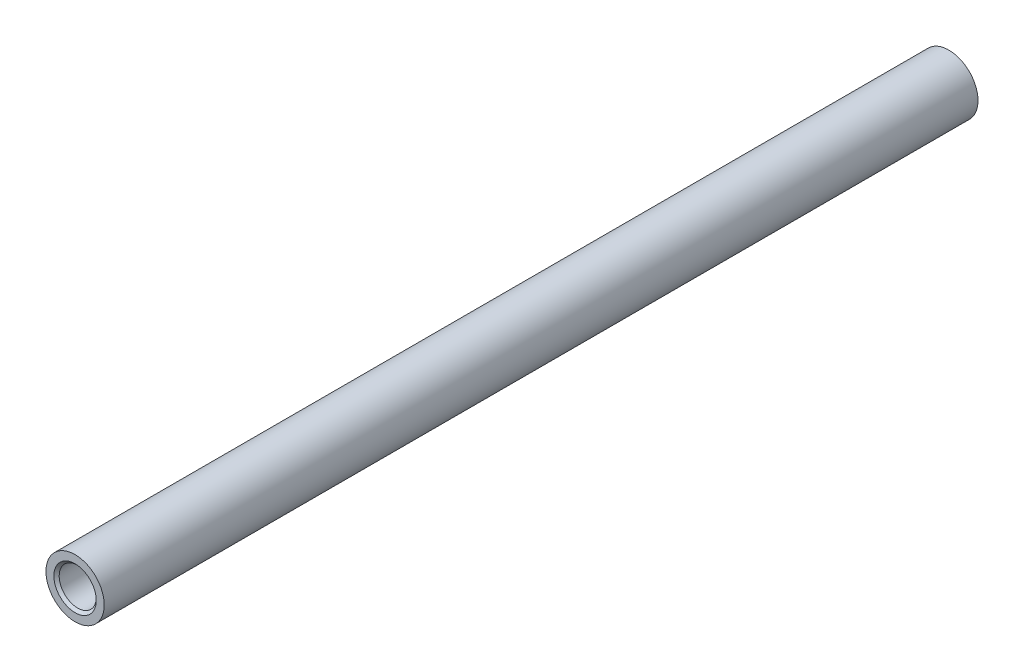
ISO-10303-21;
HEADER;
FILE_DESCRIPTION(('STEP AP214'),'2;1');
FILE_NAME('part.step','',(''),(''),'','','');
FILE_SCHEMA(('AUTOMOTIVE_DESIGN { 1 0 10303 214 1 1 1 1 }'));
ENDSEC;
DATA;
#1=APPLICATION_CONTEXT('core data for automotive mechanical design processes');
#2=APPLICATION_PROTOCOL_DEFINITION('international standard','automotive_design',2000,#1);
#3=PRODUCT_CONTEXT('',#1,'mechanical');
#4=PRODUCT('Part','Part','',(#3));
#5=PRODUCT_RELATED_PRODUCT_CATEGORY('part','',(#4));
#6=PRODUCT_DEFINITION_FORMATION('','',#4);
#7=PRODUCT_DEFINITION_CONTEXT('part definition',#1,'design');
#8=PRODUCT_DEFINITION('design','',#6,#7);
#9=PRODUCT_DEFINITION_SHAPE('','',#8);
#10=(LENGTH_UNIT() NAMED_UNIT(*) SI_UNIT(.MILLI.,.METRE.));
#11=(NAMED_UNIT(*) PLANE_ANGLE_UNIT() SI_UNIT($,.RADIAN.));
#12=(NAMED_UNIT(*) SI_UNIT($,.STERADIAN.) SOLID_ANGLE_UNIT());
#13=UNCERTAINTY_MEASURE_WITH_UNIT(LENGTH_MEASURE(1.E-05),#10,'distance_accuracy_value','');
#14=(GEOMETRIC_REPRESENTATION_CONTEXT(3) GLOBAL_UNCERTAINTY_ASSIGNED_CONTEXT((#13)) GLOBAL_UNIT_ASSIGNED_CONTEXT((#10,
#11,#12)) REPRESENTATION_CONTEXT('',''));
#15=CARTESIAN_POINT('',(0.,0.,0.));
#16=DIRECTION('',(0.,0.,1.));
#17=DIRECTION('',(1.,0.,0.));
#18=AXIS2_PLACEMENT_3D('',#15,#16,#17);
#19=CARTESIAN_POINT('',(0.,0.,165.));
#20=DIRECTION('',(0.,0.,-1.));
#21=DIRECTION('',(-1.,0.,0.));
#22=AXIS2_PLACEMENT_3D('',#19,#20,#21);
#23=CYLINDRICAL_SURFACE('',#22,7.);
#24=CARTESIAN_POINT('',(0.,0.,164.));
#25=DIRECTION('',(0.,0.,1.));
#26=DIRECTION('',(1.,0.,0.));
#27=AXIS2_PLACEMENT_3D('',#24,#25,#26);
#28=CIRCLE('',#27,7.);
#29=CARTESIAN_POINT('',(7.,0.,164.));
#30=VERTEX_POINT('',#29);
#31=EDGE_CURVE('E41',#30,#30,#28,.T.);
#32=ORIENTED_EDGE('',*,*,#31,.T.);
#33=EDGE_LOOP('',(#32));
#34=FACE_BOUND('',#33,.T.);
#35=CARTESIAN_POINT('',(0.,0.,-115.));
#36=DIRECTION('',(0.,0.,-1.));
#37=DIRECTION('',(-1.,0.,0.));
#38=AXIS2_PLACEMENT_3D('',#35,#36,#37);
#39=CIRCLE('',#38,7.);
#40=CARTESIAN_POINT('',(-7.,0.,-115.));
#41=VERTEX_POINT('',#40);
#42=EDGE_CURVE('E52',#41,#41,#39,.T.);
#43=ORIENTED_EDGE('',*,*,#42,.T.);
#44=EDGE_LOOP('',(#43));
#45=FACE_BOUND('',#44,.T.);
#46=ADVANCED_FACE('F33',(#34,#45),#23,.F.);
#47=CARTESIAN_POINT('',(0.,0.,165.));
#48=DIRECTION('',(0.,0.,1.));
#49=DIRECTION('',(1.,0.,0.));
#50=AXIS2_PLACEMENT_3D('',#47,#48,#49);
#51=PLANE('',#50);
#52=CARTESIAN_POINT('',(0.,0.,165.));
#53=DIRECTION('',(0.,0.,1.));
#54=DIRECTION('',(1.,0.,0.));
#55=AXIS2_PLACEMENT_3D('',#52,#53,#54);
#56=CIRCLE('',#55,8.00000000000006);
#57=CARTESIAN_POINT('',(8.00000000000006,0.,165.));
#58=VERTEX_POINT('',#57);
#59=EDGE_CURVE('E10',#58,#58,#56,.F.);
#60=ORIENTED_EDGE('',*,*,#59,.T.);
#61=EDGE_LOOP('',(#60));
#62=FACE_BOUND('',#61,.T.);
#63=CARTESIAN_POINT('',(0.,0.,165.));
#64=DIRECTION('',(0.,0.,1.));
#65=DIRECTION('',(1.,0.,0.));
#66=AXIS2_PLACEMENT_3D('',#63,#64,#65);
#67=CIRCLE('',#66,11.);
#68=CARTESIAN_POINT('',(11.,0.,165.));
#69=VERTEX_POINT('',#68);
#70=EDGE_CURVE('E45',#69,#69,#67,.T.);
#71=ORIENTED_EDGE('',*,*,#70,.T.);
#72=EDGE_LOOP('',(#71));
#73=FACE_BOUND('',#72,.T.);
#74=ADVANCED_FACE('F76',(#62,#73),#51,.T.);
#75=CARTESIAN_POINT('',(0.,0.,-165.));
#76=DIRECTION('',(0.,0.,1.));
#77=DIRECTION('',(1.,0.,0.));
#78=AXIS2_PLACEMENT_3D('',#75,#76,#77);
#79=PLANE('',#78);
#80=CARTESIAN_POINT('',(0.,0.,-165.));
#81=DIRECTION('',(0.,0.,-1.));
#82=DIRECTION('',(-1.,0.,0.));
#83=AXIS2_PLACEMENT_3D('',#80,#81,#82);
#84=CIRCLE('',#83,8.);
#85=CARTESIAN_POINT('',(-8.,0.,-165.));
#86=VERTEX_POINT('',#85);
#87=EDGE_CURVE('E58',#86,#86,#84,.T.);
#88=ORIENTED_EDGE('',*,*,#87,.F.);
#89=EDGE_LOOP('',(#88));
#90=FACE_BOUND('',#89,.T.);
#91=CARTESIAN_POINT('',(0.,0.,-165.));
#92=DIRECTION('',(0.,0.,1.));
#93=DIRECTION('',(1.,0.,0.));
#94=AXIS2_PLACEMENT_3D('',#91,#92,#93);
#95=CIRCLE('',#94,11.);
#96=CARTESIAN_POINT('',(11.,0.,-165.));
#97=VERTEX_POINT('',#96);
#98=EDGE_CURVE('E49',#97,#97,#95,.T.);
#99=ORIENTED_EDGE('',*,*,#98,.F.);
#100=EDGE_LOOP('',(#99));
#101=FACE_BOUND('',#100,.T.);
#102=ADVANCED_FACE('F73',(#90,#101),#79,.F.);
#103=CARTESIAN_POINT('',(0.,0.,165.));
#104=DIRECTION('',(0.,0.,-1.));
#105=DIRECTION('',(-1.,0.,0.));
#106=AXIS2_PLACEMENT_3D('',#103,#104,#105);
#107=CYLINDRICAL_SURFACE('',#106,11.);
#108=ORIENTED_EDGE('',*,*,#70,.F.);
#109=EDGE_LOOP('',(#108));
#110=FACE_BOUND('',#109,.T.);
#111=ORIENTED_EDGE('',*,*,#98,.T.);
#112=EDGE_LOOP('',(#111));
#113=FACE_BOUND('',#112,.T.);
#114=ADVANCED_FACE('F69',(#110,#113),#107,.T.);
#115=CARTESIAN_POINT('',(0.,0.,-115.));
#116=DIRECTION('',(0.,0.,-1.));
#117=DIRECTION('',(-1.,0.,0.));
#118=AXIS2_PLACEMENT_3D('',#115,#116,#117);
#119=CYLINDRICAL_SURFACE('',#118,8.);
#120=CARTESIAN_POINT('',(0.,0.,-115.));
#121=DIRECTION('',(0.,0.,-1.));
#122=DIRECTION('',(-1.,0.,0.));
#123=AXIS2_PLACEMENT_3D('',#120,#121,#122);
#124=CIRCLE('',#123,8.);
#125=CARTESIAN_POINT('',(-8.,0.,-115.));
#126=VERTEX_POINT('',#125);
#127=EDGE_CURVE('E55',#126,#126,#124,.T.);
#128=ORIENTED_EDGE('',*,*,#127,.F.);
#129=EDGE_LOOP('',(#128));
#130=FACE_BOUND('',#129,.T.);
#131=ORIENTED_EDGE('',*,*,#87,.T.);
#132=EDGE_LOOP('',(#131));
#133=FACE_BOUND('',#132,.T.);
#134=ADVANCED_FACE('F66',(#130,#133),#119,.F.);
#135=CARTESIAN_POINT('',(0.,0.,-115.));
#136=DIRECTION('',(0.,0.,-1.));
#137=DIRECTION('',(-1.,0.,0.));
#138=AXIS2_PLACEMENT_3D('',#135,#136,#137);
#139=PLANE('',#138);
#140=ORIENTED_EDGE('',*,*,#42,.F.);
#141=EDGE_LOOP('',(#140));
#142=FACE_BOUND('',#141,.T.);
#143=ORIENTED_EDGE('',*,*,#127,.T.);
#144=EDGE_LOOP('',(#143));
#145=FACE_BOUND('',#144,.T.);
#146=ADVANCED_FACE('F64',(#142,#145),#139,.T.);
#147=CARTESIAN_POINT('',(0.,0.,164.));
#148=DIRECTION('',(0.,0.,1.));
#149=DIRECTION('',(1.,0.,0.));
#150=AXIS2_PLACEMENT_3D('',#147,#148,#149);
#151=CONICAL_SURFACE('',#150,7.,0.785398163397438);
#152=ORIENTED_EDGE('',*,*,#59,.F.);
#153=EDGE_LOOP('',(#152));
#154=FACE_BOUND('',#153,.T.);
#155=ORIENTED_EDGE('',*,*,#31,.F.);
#156=EDGE_LOOP('',(#155));
#157=FACE_BOUND('',#156,.T.);
#158=ADVANCED_FACE('F36',(#154,#157),#151,.F.);
#159=CLOSED_SHELL('',(#46,#74,#102,#114,#134,#146,#158));
#160=MANIFOLD_SOLID_BREP('B2',#159);
#161=ADVANCED_BREP_SHAPE_REPRESENTATION('',(#18,#160),#14);
#162=SHAPE_DEFINITION_REPRESENTATION(#9,#161);
ENDSEC;
END-ISO-10303-21;
